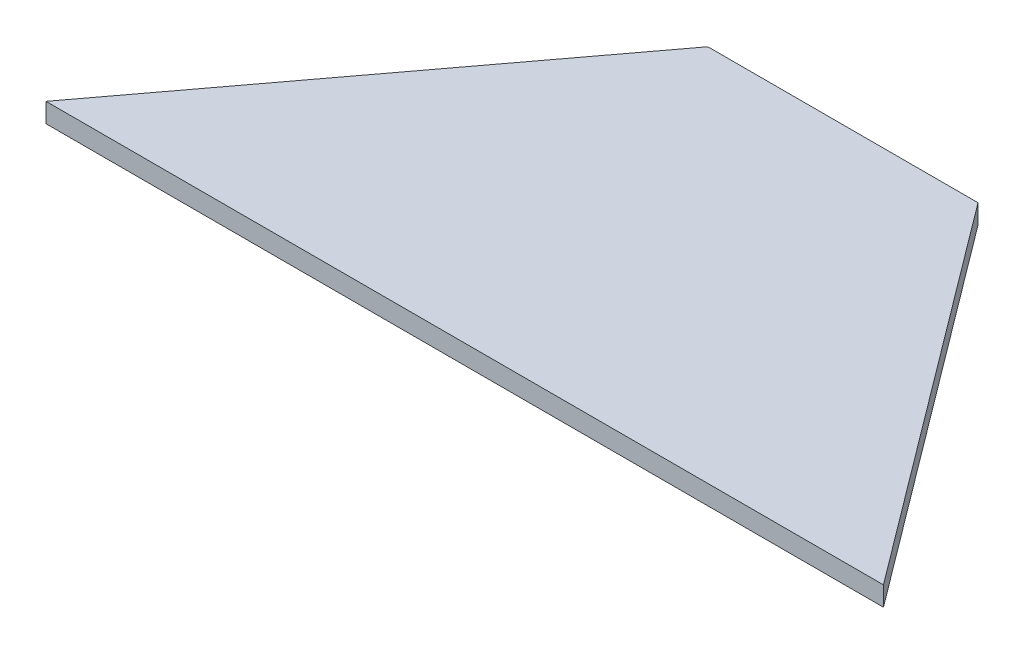
ISO-10303-21;
HEADER;
FILE_DESCRIPTION(('STEP AP214'),'2;1');
FILE_NAME('part.step','',(''),(''),'','','');
FILE_SCHEMA(('AUTOMOTIVE_DESIGN { 1 0 10303 214 1 1 1 1 }'));
ENDSEC;
DATA;
#1=APPLICATION_CONTEXT('core data for automotive mechanical design processes');
#2=APPLICATION_PROTOCOL_DEFINITION('international standard','automotive_design',2000,#1);
#3=PRODUCT_CONTEXT('',#1,'mechanical');
#4=PRODUCT('Part','Part','',(#3));
#5=PRODUCT_RELATED_PRODUCT_CATEGORY('part','',(#4));
#6=PRODUCT_DEFINITION_FORMATION('','',#4);
#7=PRODUCT_DEFINITION_CONTEXT('part definition',#1,'design');
#8=PRODUCT_DEFINITION('design','',#6,#7);
#9=PRODUCT_DEFINITION_SHAPE('','',#8);
#10=(LENGTH_UNIT() NAMED_UNIT(*) SI_UNIT(.MILLI.,.METRE.));
#11=(NAMED_UNIT(*) PLANE_ANGLE_UNIT() SI_UNIT($,.RADIAN.));
#12=(NAMED_UNIT(*) SI_UNIT($,.STERADIAN.) SOLID_ANGLE_UNIT());
#13=UNCERTAINTY_MEASURE_WITH_UNIT(LENGTH_MEASURE(1.E-05),#10,'distance_accuracy_value','');
#14=(GEOMETRIC_REPRESENTATION_CONTEXT(3) GLOBAL_UNCERTAINTY_ASSIGNED_CONTEXT((#13)) GLOBAL_UNIT_ASSIGNED_CONTEXT((#10,
#11,#12)) REPRESENTATION_CONTEXT('',''));
#15=CARTESIAN_POINT('',(0.,0.,0.));
#16=DIRECTION('',(0.,0.,1.));
#17=DIRECTION('',(1.,0.,0.));
#18=AXIS2_PLACEMENT_3D('',#15,#16,#17);
#19=CARTESIAN_POINT('',(-127.,18.25625,-355.6));
#20=DIRECTION('',(0.,0.,1.));
#21=DIRECTION('',(1.,0.,0.));
#22=AXIS2_PLACEMENT_3D('',#19,#20,#21);
#23=PLANE('',#22);
#24=DIRECTION('',(-1.,0.,0.));
#25=VECTOR('',#24,1.);
#26=CARTESIAN_POINT('',(-127.,0.,-355.6));
#27=LINE('',#26,#25);
#28=CARTESIAN_POINT('',(127.,0.,-355.6));
#29=VERTEX_POINT('',#28);
#30=CARTESIAN_POINT('',(-127.,0.,-355.6));
#31=VERTEX_POINT('',#30);
#32=EDGE_CURVE('E96',#29,#31,#27,.T.);
#33=ORIENTED_EDGE('',*,*,#32,.T.);
#34=DIRECTION('',(0.,-1.,0.));
#35=VECTOR('',#34,1.);
#36=CARTESIAN_POINT('',(-127.,18.25625,-355.6));
#37=LINE('',#36,#35);
#38=CARTESIAN_POINT('',(-127.,18.25625,-355.6));
#39=VERTEX_POINT('',#38);
#40=EDGE_CURVE('E11',#39,#31,#37,.T.);
#41=ORIENTED_EDGE('',*,*,#40,.F.);
#42=DIRECTION('',(-1.,0.,0.));
#43=VECTOR('',#42,1.);
#44=CARTESIAN_POINT('',(-127.,18.25625,-355.6));
#45=LINE('',#44,#43);
#46=CARTESIAN_POINT('',(127.,18.25625,-355.6));
#47=VERTEX_POINT('',#46);
#48=EDGE_CURVE('E84',#47,#39,#45,.T.);
#49=ORIENTED_EDGE('',*,*,#48,.F.);
#50=DIRECTION('',(0.,-1.,0.));
#51=VECTOR('',#50,1.);
#52=CARTESIAN_POINT('',(127.,18.25625,-355.6));
#53=LINE('',#52,#51);
#54=EDGE_CURVE('E92',#47,#29,#53,.T.);
#55=ORIENTED_EDGE('',*,*,#54,.T.);
#56=EDGE_LOOP('',(#33,#41,#49,#55));
#57=FACE_BOUND('',#56,.T.);
#58=ADVANCED_FACE('F33',(#57),#23,.F.);
#59=CARTESIAN_POINT('',(-393.7,18.25625,0.));
#60=DIRECTION('',(0.8,0.,0.6));
#61=DIRECTION('',(0.6,0.,-0.8));
#62=AXIS2_PLACEMENT_3D('',#59,#60,#61);
#63=PLANE('',#62);
#64=DIRECTION('',(-0.6,0.,0.8));
#65=VECTOR('',#64,1.);
#66=CARTESIAN_POINT('',(-393.7,0.,0.));
#67=LINE('',#66,#65);
#68=CARTESIAN_POINT('',(-393.7,0.,0.));
#69=VERTEX_POINT('',#68);
#70=EDGE_CURVE('E88',#31,#69,#67,.T.);
#71=ORIENTED_EDGE('',*,*,#70,.T.);
#72=DIRECTION('',(0.,-1.,0.));
#73=VECTOR('',#72,1.);
#74=CARTESIAN_POINT('',(-393.7,18.25625,0.));
#75=LINE('',#74,#73);
#76=CARTESIAN_POINT('',(-393.7,18.25625,0.));
#77=VERTEX_POINT('',#76);
#78=EDGE_CURVE('E41',#77,#69,#75,.T.);
#79=ORIENTED_EDGE('',*,*,#78,.F.);
#80=DIRECTION('',(-0.6,0.,0.8));
#81=VECTOR('',#80,1.);
#82=CARTESIAN_POINT('',(-393.7,18.25625,0.));
#83=LINE('',#82,#81);
#84=EDGE_CURVE('E79',#39,#77,#83,.T.);
#85=ORIENTED_EDGE('',*,*,#84,.F.);
#86=ORIENTED_EDGE('',*,*,#40,.T.);
#87=EDGE_LOOP('',(#71,#79,#85,#86));
#88=FACE_BOUND('',#87,.T.);
#89=ADVANCED_FACE('F87',(#88),#63,.F.);
#90=CARTESIAN_POINT('',(393.7,18.25625,0.));
#91=DIRECTION('',(0.,0.,-1.));
#92=DIRECTION('',(-1.,0.,0.));
#93=AXIS2_PLACEMENT_3D('',#90,#91,#92);
#94=PLANE('',#93);
#95=DIRECTION('',(1.,0.,0.));
#96=VECTOR('',#95,1.);
#97=CARTESIAN_POINT('',(393.7,0.,0.));
#98=LINE('',#97,#96);
#99=CARTESIAN_POINT('',(393.7,0.,0.));
#100=VERTEX_POINT('',#99);
#101=EDGE_CURVE('E66',#69,#100,#98,.T.);
#102=ORIENTED_EDGE('',*,*,#101,.T.);
#103=DIRECTION('',(0.,-1.,0.));
#104=VECTOR('',#103,1.);
#105=CARTESIAN_POINT('',(393.7,18.25625,0.));
#106=LINE('',#105,#104);
#107=CARTESIAN_POINT('',(393.7,18.25625,0.));
#108=VERTEX_POINT('',#107);
#109=EDGE_CURVE('E89',#108,#100,#106,.T.);
#110=ORIENTED_EDGE('',*,*,#109,.F.);
#111=DIRECTION('',(1.,0.,0.));
#112=VECTOR('',#111,1.);
#113=CARTESIAN_POINT('',(393.7,18.25625,0.));
#114=LINE('',#113,#112);
#115=EDGE_CURVE('E82',#77,#108,#114,.T.);
#116=ORIENTED_EDGE('',*,*,#115,.F.);
#117=ORIENTED_EDGE('',*,*,#78,.T.);
#118=EDGE_LOOP('',(#102,#110,#116,#117));
#119=FACE_BOUND('',#118,.T.);
#120=ADVANCED_FACE('F90',(#119),#94,.F.);
#121=CARTESIAN_POINT('',(127.,18.25625,-355.6));
#122=DIRECTION('',(-0.8,0.,0.6));
#123=DIRECTION('',(0.6,0.,0.8));
#124=AXIS2_PLACEMENT_3D('',#121,#122,#123);
#125=PLANE('',#124);
#126=DIRECTION('',(-0.6,0.,-0.8));
#127=VECTOR('',#126,1.);
#128=CARTESIAN_POINT('',(127.,0.,-355.6));
#129=LINE('',#128,#127);
#130=EDGE_CURVE('E72',#100,#29,#129,.T.);
#131=ORIENTED_EDGE('',*,*,#130,.T.);
#132=ORIENTED_EDGE('',*,*,#54,.F.);
#133=DIRECTION('',(-0.6,0.,-0.8));
#134=VECTOR('',#133,1.);
#135=CARTESIAN_POINT('',(127.,18.25625,-355.6));
#136=LINE('',#135,#134);
#137=EDGE_CURVE('E49',#108,#47,#136,.T.);
#138=ORIENTED_EDGE('',*,*,#137,.F.);
#139=ORIENTED_EDGE('',*,*,#109,.T.);
#140=EDGE_LOOP('',(#131,#132,#138,#139));
#141=FACE_BOUND('',#140,.T.);
#142=ADVANCED_FACE('F103',(#141),#125,.F.);
#143=CARTESIAN_POINT('',(0.,18.25625,0.));
#144=DIRECTION('',(0.,-1.,0.));
#145=DIRECTION('',(0.,0.,-1.));
#146=AXIS2_PLACEMENT_3D('',#143,#144,#145);
#147=PLANE('',#146);
#148=ORIENTED_EDGE('',*,*,#48,.T.);
#149=ORIENTED_EDGE('',*,*,#84,.T.);
#150=ORIENTED_EDGE('',*,*,#115,.T.);
#151=ORIENTED_EDGE('',*,*,#137,.T.);
#152=EDGE_LOOP('',(#148,#149,#150,#151));
#153=FACE_BOUND('',#152,.T.);
#154=ADVANCED_FACE('F80',(#153),#147,.F.);
#155=CARTESIAN_POINT('',(0.,0.,0.));
#156=DIRECTION('',(0.,-1.,0.));
#157=DIRECTION('',(0.,0.,-1.));
#158=AXIS2_PLACEMENT_3D('',#155,#156,#157);
#159=PLANE('',#158);
#160=ORIENTED_EDGE('',*,*,#32,.F.);
#161=ORIENTED_EDGE('',*,*,#130,.F.);
#162=ORIENTED_EDGE('',*,*,#101,.F.);
#163=ORIENTED_EDGE('',*,*,#70,.F.);
#164=EDGE_LOOP('',(#160,#161,#162,#163));
#165=FACE_BOUND('',#164,.T.);
#166=ADVANCED_FACE('F106',(#165),#159,.T.);
#167=CLOSED_SHELL('',(#58,#89,#120,#142,#154,#166));
#168=MANIFOLD_SOLID_BREP('B2',#167);
#169=ADVANCED_BREP_SHAPE_REPRESENTATION('',(#18,#168),#14);
#170=SHAPE_DEFINITION_REPRESENTATION(#9,#169);
ENDSEC;
END-ISO-10303-21;
